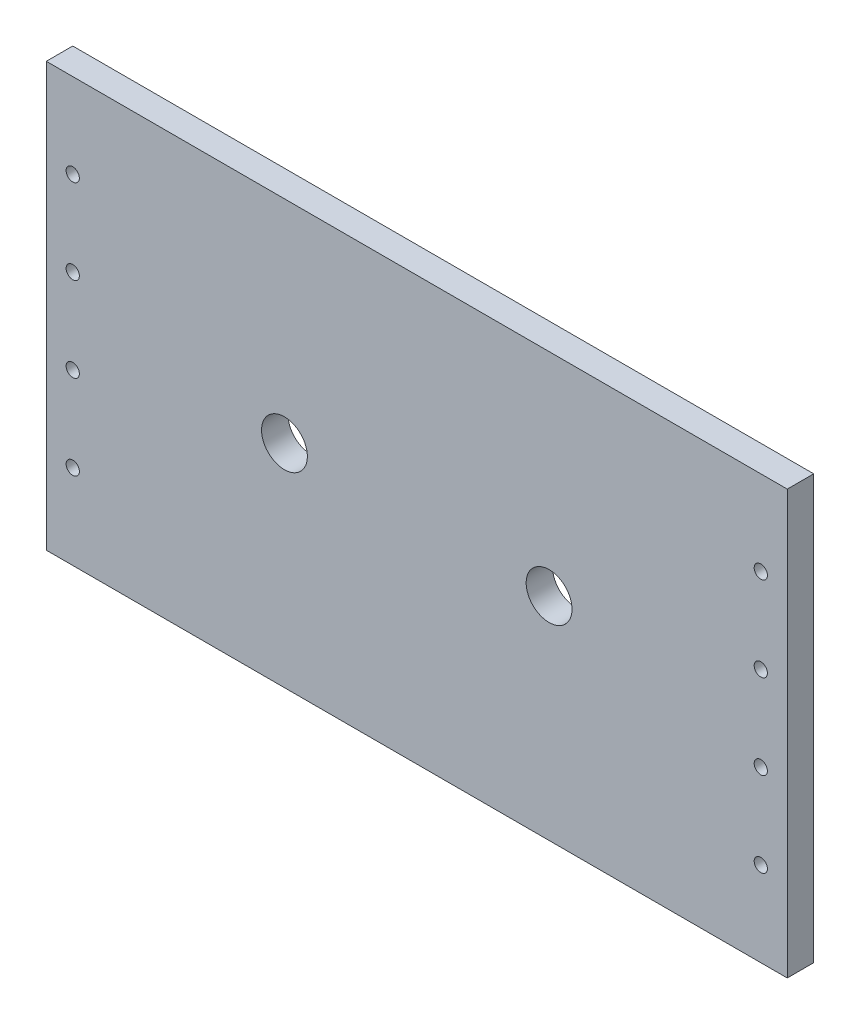
ISO-10303-21;
HEADER;
FILE_DESCRIPTION(('STEP AP214'),'2;1');
FILE_NAME('part.step','',(''),(''),'','','');
FILE_SCHEMA(('AUTOMOTIVE_DESIGN { 1 0 10303 214 1 1 1 1 }'));
ENDSEC;
DATA;
#1=APPLICATION_CONTEXT('core data for automotive mechanical design processes');
#2=APPLICATION_PROTOCOL_DEFINITION('international standard','automotive_design',2000,#1);
#3=PRODUCT_CONTEXT('',#1,'mechanical');
#4=PRODUCT('Part','Part','',(#3));
#5=PRODUCT_RELATED_PRODUCT_CATEGORY('part','',(#4));
#6=PRODUCT_DEFINITION_FORMATION('','',#4);
#7=PRODUCT_DEFINITION_CONTEXT('part definition',#1,'design');
#8=PRODUCT_DEFINITION('design','',#6,#7);
#9=PRODUCT_DEFINITION_SHAPE('','',#8);
#10=(LENGTH_UNIT() NAMED_UNIT(*) SI_UNIT(.MILLI.,.METRE.));
#11=(NAMED_UNIT(*) PLANE_ANGLE_UNIT() SI_UNIT($,.RADIAN.));
#12=(NAMED_UNIT(*) SI_UNIT($,.STERADIAN.) SOLID_ANGLE_UNIT());
#13=UNCERTAINTY_MEASURE_WITH_UNIT(LENGTH_MEASURE(1.E-05),#10,'distance_accuracy_value','');
#14=(GEOMETRIC_REPRESENTATION_CONTEXT(3) GLOBAL_UNCERTAINTY_ASSIGNED_CONTEXT((#13)) GLOBAL_UNIT_ASSIGNED_CONTEXT((#10,
#11,#12)) REPRESENTATION_CONTEXT('',''));
#15=CARTESIAN_POINT('',(0.,0.,0.));
#16=DIRECTION('',(0.,0.,1.));
#17=DIRECTION('',(1.,0.,0.));
#18=AXIS2_PLACEMENT_3D('',#15,#16,#17);
#19=CARTESIAN_POINT('',(0.,0.,6.35));
#20=DIRECTION('',(1.,0.,0.));
#21=DIRECTION('',(0.,0.,-1.));
#22=AXIS2_PLACEMENT_3D('',#19,#20,#21);
#23=PLANE('',#22);
#24=DIRECTION('',(0.,-1.,0.));
#25=VECTOR('',#24,1.);
#26=CARTESIAN_POINT('',(0.,0.,0.));
#27=LINE('',#26,#25);
#28=CARTESIAN_POINT('',(0.,101.6,0.));
#29=VERTEX_POINT('',#28);
#30=CARTESIAN_POINT('',(0.,0.,0.));
#31=VERTEX_POINT('',#30);
#32=EDGE_CURVE('E107',#29,#31,#27,.T.);
#33=ORIENTED_EDGE('',*,*,#32,.T.);
#34=DIRECTION('',(0.,0.,-1.));
#35=VECTOR('',#34,1.);
#36=CARTESIAN_POINT('',(0.,0.,6.35));
#37=LINE('',#36,#35);
#38=CARTESIAN_POINT('',(0.,0.,6.35));
#39=VERTEX_POINT('',#38);
#40=EDGE_CURVE('E11',#39,#31,#37,.T.);
#41=ORIENTED_EDGE('',*,*,#40,.F.);
#42=DIRECTION('',(0.,-1.,0.));
#43=VECTOR('',#42,1.);
#44=CARTESIAN_POINT('',(0.,0.,6.35));
#45=LINE('',#44,#43);
#46=CARTESIAN_POINT('',(0.,101.6,6.35));
#47=VERTEX_POINT('',#46);
#48=EDGE_CURVE('E91',#47,#39,#45,.T.);
#49=ORIENTED_EDGE('',*,*,#48,.F.);
#50=DIRECTION('',(0.,0.,-1.));
#51=VECTOR('',#50,1.);
#52=CARTESIAN_POINT('',(0.,101.6,6.35));
#53=LINE('',#52,#51);
#54=EDGE_CURVE('E103',#47,#29,#53,.T.);
#55=ORIENTED_EDGE('',*,*,#54,.T.);
#56=EDGE_LOOP('',(#33,#41,#49,#55));
#57=FACE_BOUND('',#56,.T.);
#58=ADVANCED_FACE('F39',(#57),#23,.F.);
#59=CARTESIAN_POINT('',(0.,0.,6.35));
#60=DIRECTION('',(0.,1.,0.));
#61=DIRECTION('',(0.,0.,1.));
#62=AXIS2_PLACEMENT_3D('',#59,#60,#61);
#63=PLANE('',#62);
#64=DIRECTION('',(1.,0.,0.));
#65=VECTOR('',#64,1.);
#66=CARTESIAN_POINT('',(0.,0.,0.));
#67=LINE('',#66,#65);
#68=CARTESIAN_POINT('',(177.8,0.,0.));
#69=VERTEX_POINT('',#68);
#70=EDGE_CURVE('E96',#31,#69,#67,.T.);
#71=ORIENTED_EDGE('',*,*,#70,.T.);
#72=DIRECTION('',(0.,0.,-1.));
#73=VECTOR('',#72,1.);
#74=CARTESIAN_POINT('',(177.8,0.,6.35));
#75=LINE('',#74,#73);
#76=CARTESIAN_POINT('',(177.8,0.,6.35));
#77=VERTEX_POINT('',#76);
#78=EDGE_CURVE('E48',#77,#69,#75,.T.);
#79=ORIENTED_EDGE('',*,*,#78,.F.);
#80=DIRECTION('',(1.,0.,0.));
#81=VECTOR('',#80,1.);
#82=CARTESIAN_POINT('',(0.,0.,6.35));
#83=LINE('',#82,#81);
#84=EDGE_CURVE('E86',#39,#77,#83,.T.);
#85=ORIENTED_EDGE('',*,*,#84,.F.);
#86=ORIENTED_EDGE('',*,*,#40,.T.);
#87=EDGE_LOOP('',(#71,#79,#85,#86));
#88=FACE_BOUND('',#87,.T.);
#89=ADVANCED_FACE('F95',(#88),#63,.F.);
#90=CARTESIAN_POINT('',(177.8,0.,6.35));
#91=DIRECTION('',(-1.,0.,0.));
#92=DIRECTION('',(0.,0.,1.));
#93=AXIS2_PLACEMENT_3D('',#90,#91,#92);
#94=PLANE('',#93);
#95=DIRECTION('',(0.,1.,0.));
#96=VECTOR('',#95,1.);
#97=CARTESIAN_POINT('',(177.8,0.,0.));
#98=LINE('',#97,#96);
#99=CARTESIAN_POINT('',(177.8,101.6,0.));
#100=VERTEX_POINT('',#99);
#101=EDGE_CURVE('E73',#69,#100,#98,.T.);
#102=ORIENTED_EDGE('',*,*,#101,.T.);
#103=DIRECTION('',(0.,0.,-1.));
#104=VECTOR('',#103,1.);
#105=CARTESIAN_POINT('',(177.8,101.6,6.35));
#106=LINE('',#105,#104);
#107=CARTESIAN_POINT('',(177.8,101.6,6.35));
#108=VERTEX_POINT('',#107);
#109=EDGE_CURVE('E98',#108,#100,#106,.T.);
#110=ORIENTED_EDGE('',*,*,#109,.F.);
#111=DIRECTION('',(0.,1.,0.));
#112=VECTOR('',#111,1.);
#113=CARTESIAN_POINT('',(177.8,0.,6.35));
#114=LINE('',#113,#112);
#115=EDGE_CURVE('E89',#77,#108,#114,.T.);
#116=ORIENTED_EDGE('',*,*,#115,.F.);
#117=ORIENTED_EDGE('',*,*,#78,.T.);
#118=EDGE_LOOP('',(#102,#110,#116,#117));
#119=FACE_BOUND('',#118,.T.);
#120=ADVANCED_FACE('F99',(#119),#94,.F.);
#121=CARTESIAN_POINT('',(0.,101.6,6.35));
#122=DIRECTION('',(0.,-1.,0.));
#123=DIRECTION('',(0.,0.,-1.));
#124=AXIS2_PLACEMENT_3D('',#121,#122,#123);
#125=PLANE('',#124);
#126=DIRECTION('',(-1.,0.,0.));
#127=VECTOR('',#126,1.);
#128=CARTESIAN_POINT('',(0.,101.6,0.));
#129=LINE('',#128,#127);
#130=EDGE_CURVE('E79',#100,#29,#129,.T.);
#131=ORIENTED_EDGE('',*,*,#130,.T.);
#132=ORIENTED_EDGE('',*,*,#54,.F.);
#133=DIRECTION('',(-1.,0.,0.));
#134=VECTOR('',#133,1.);
#135=CARTESIAN_POINT('',(0.,101.6,6.35));
#136=LINE('',#135,#134);
#137=EDGE_CURVE('E56',#108,#47,#136,.T.);
#138=ORIENTED_EDGE('',*,*,#137,.F.);
#139=ORIENTED_EDGE('',*,*,#109,.T.);
#140=EDGE_LOOP('',(#131,#132,#138,#139));
#141=FACE_BOUND('',#140,.T.);
#142=ADVANCED_FACE('F121',(#141),#125,.F.);
#143=CARTESIAN_POINT('',(0.,0.,6.35));
#144=DIRECTION('',(0.,0.,-1.));
#145=DIRECTION('',(-1.,0.,0.));
#146=AXIS2_PLACEMENT_3D('',#143,#144,#145);
#147=PLANE('',#146);
#148=CARTESIAN_POINT('',(120.65,50.8,6.35));
#149=DIRECTION('',(0.,0.,1.));
#150=DIRECTION('',(1.,0.,0.));
#151=AXIS2_PLACEMENT_3D('',#148,#149,#150);
#152=CIRCLE('',#151,5.49926131403117);
#153=CARTESIAN_POINT('',(126.149261314031,50.8,6.35));
#154=VERTEX_POINT('',#153);
#155=EDGE_CURVE('E200',#154,#154,#152,.T.);
#156=ORIENTED_EDGE('',*,*,#155,.F.);
#157=EDGE_LOOP('',(#156));
#158=FACE_BOUND('',#157,.T.);
#159=CARTESIAN_POINT('',(57.15,50.8,6.35));
#160=DIRECTION('',(0.,0.,1.));
#161=DIRECTION('',(1.,0.,0.));
#162=AXIS2_PLACEMENT_3D('',#159,#160,#161);
#163=CIRCLE('',#162,5.49926131403118);
#164=CARTESIAN_POINT('',(62.6492613140312,50.8,6.35));
#165=VERTEX_POINT('',#164);
#166=EDGE_CURVE('E192',#165,#165,#163,.T.);
#167=ORIENTED_EDGE('',*,*,#166,.F.);
#168=EDGE_LOOP('',(#167));
#169=FACE_BOUND('',#168,.T.);
#170=CARTESIAN_POINT('',(6.34999999999999,60.96,6.35));
#171=DIRECTION('',(0.,0.,1.));
#172=DIRECTION('',(1.,0.,0.));
#173=AXIS2_PLACEMENT_3D('',#170,#171,#172);
#174=CIRCLE('',#173,1.5875);
#175=CARTESIAN_POINT('',(7.9375,60.96,6.35));
#176=VERTEX_POINT('',#175);
#177=EDGE_CURVE('E161',#176,#176,#174,.T.);
#178=ORIENTED_EDGE('',*,*,#177,.F.);
#179=EDGE_LOOP('',(#178));
#180=FACE_BOUND('',#179,.T.);
#181=CARTESIAN_POINT('',(6.34999999999999,40.64,6.35));
#182=DIRECTION('',(0.,0.,1.));
#183=DIRECTION('',(1.,0.,0.));
#184=AXIS2_PLACEMENT_3D('',#181,#182,#183);
#185=CIRCLE('',#184,1.5875);
#186=CARTESIAN_POINT('',(7.93749999999999,40.64,6.35));
#187=VERTEX_POINT('',#186);
#188=EDGE_CURVE('E153',#187,#187,#185,.T.);
#189=ORIENTED_EDGE('',*,*,#188,.F.);
#190=EDGE_LOOP('',(#189));
#191=FACE_BOUND('',#190,.T.);
#192=CARTESIAN_POINT('',(6.34999999999999,20.32,6.35));
#193=DIRECTION('',(0.,0.,1.));
#194=DIRECTION('',(1.,0.,0.));
#195=AXIS2_PLACEMENT_3D('',#192,#193,#194);
#196=CIRCLE('',#195,1.5875);
#197=CARTESIAN_POINT('',(7.93749999999999,20.32,6.35));
#198=VERTEX_POINT('',#197);
#199=EDGE_CURVE('E145',#198,#198,#196,.T.);
#200=ORIENTED_EDGE('',*,*,#199,.F.);
#201=EDGE_LOOP('',(#200));
#202=FACE_BOUND('',#201,.T.);
#203=CARTESIAN_POINT('',(171.45,20.32,6.35));
#204=DIRECTION('',(0.,0.,1.));
#205=DIRECTION('',(1.,0.,0.));
#206=AXIS2_PLACEMENT_3D('',#203,#204,#205);
#207=CIRCLE('',#206,1.58749999999999);
#208=CARTESIAN_POINT('',(173.0375,20.32,6.35));
#209=VERTEX_POINT('',#208);
#210=EDGE_CURVE('E136',#209,#209,#207,.T.);
#211=ORIENTED_EDGE('',*,*,#210,.F.);
#212=EDGE_LOOP('',(#211));
#213=FACE_BOUND('',#212,.T.);
#214=CARTESIAN_POINT('',(171.45,40.64,6.35));
#215=DIRECTION('',(0.,0.,1.));
#216=DIRECTION('',(1.,0.,0.));
#217=AXIS2_PLACEMENT_3D('',#214,#215,#216);
#218=CIRCLE('',#217,1.58749999999999);
#219=CARTESIAN_POINT('',(173.0375,40.64,6.35));
#220=VERTEX_POINT('',#219);
#221=EDGE_CURVE('E185',#220,#220,#218,.T.);
#222=ORIENTED_EDGE('',*,*,#221,.F.);
#223=EDGE_LOOP('',(#222));
#224=FACE_BOUND('',#223,.T.);
#225=CARTESIAN_POINT('',(171.45,60.96,6.35));
#226=DIRECTION('',(0.,0.,1.));
#227=DIRECTION('',(1.,0.,0.));
#228=AXIS2_PLACEMENT_3D('',#225,#226,#227);
#229=CIRCLE('',#228,1.58749999999999);
#230=CARTESIAN_POINT('',(173.0375,60.96,6.35));
#231=VERTEX_POINT('',#230);
#232=EDGE_CURVE('E177',#231,#231,#229,.T.);
#233=ORIENTED_EDGE('',*,*,#232,.F.);
#234=EDGE_LOOP('',(#233));
#235=FACE_BOUND('',#234,.T.);
#236=CARTESIAN_POINT('',(171.45,81.28,6.35));
#237=DIRECTION('',(0.,0.,1.));
#238=DIRECTION('',(1.,0.,0.));
#239=AXIS2_PLACEMENT_3D('',#236,#237,#238);
#240=CIRCLE('',#239,1.58749999999999);
#241=CARTESIAN_POINT('',(173.0375,81.28,6.35));
#242=VERTEX_POINT('',#241);
#243=EDGE_CURVE('E168',#242,#242,#240,.T.);
#244=ORIENTED_EDGE('',*,*,#243,.F.);
#245=EDGE_LOOP('',(#244));
#246=FACE_BOUND('',#245,.T.);
#247=CARTESIAN_POINT('',(6.34999999999999,81.28,6.35));
#248=DIRECTION('',(0.,0.,1.));
#249=DIRECTION('',(1.,0.,0.));
#250=AXIS2_PLACEMENT_3D('',#247,#248,#249);
#251=CIRCLE('',#250,1.5875);
#252=CARTESIAN_POINT('',(7.93749999999999,81.28,6.35));
#253=VERTEX_POINT('',#252);
#254=EDGE_CURVE('E128',#253,#253,#251,.T.);
#255=ORIENTED_EDGE('',*,*,#254,.F.);
#256=EDGE_LOOP('',(#255));
#257=FACE_BOUND('',#256,.T.);
#258=ORIENTED_EDGE('',*,*,#48,.T.);
#259=ORIENTED_EDGE('',*,*,#84,.T.);
#260=ORIENTED_EDGE('',*,*,#115,.T.);
#261=ORIENTED_EDGE('',*,*,#137,.T.);
#262=EDGE_LOOP('',(#258,#259,#260,#261));
#263=FACE_BOUND('',#262,.T.);
#264=ADVANCED_FACE('F87',(#158,#169,#180,#191,#202,#213,#224,#235,#246,#257,#263),#147,.F.);
#265=CARTESIAN_POINT('',(0.,0.,0.));
#266=DIRECTION('',(0.,0.,-1.));
#267=DIRECTION('',(-1.,0.,0.));
#268=AXIS2_PLACEMENT_3D('',#265,#266,#267);
#269=PLANE('',#268);
#270=CARTESIAN_POINT('',(120.65,50.8,0.));
#271=DIRECTION('',(0.,0.,1.));
#272=DIRECTION('',(1.,0.,0.));
#273=AXIS2_PLACEMENT_3D('',#270,#271,#272);
#274=CIRCLE('',#273,5.49926131403117);
#275=CARTESIAN_POINT('',(126.149261314031,50.8,0.));
#276=VERTEX_POINT('',#275);
#277=EDGE_CURVE('E173',#276,#276,#274,.T.);
#278=ORIENTED_EDGE('',*,*,#277,.T.);
#279=EDGE_LOOP('',(#278));
#280=FACE_BOUND('',#279,.T.);
#281=CARTESIAN_POINT('',(57.15,50.8,0.));
#282=DIRECTION('',(0.,0.,1.));
#283=DIRECTION('',(1.,0.,0.));
#284=AXIS2_PLACEMENT_3D('',#281,#282,#283);
#285=CIRCLE('',#284,5.49926131403118);
#286=CARTESIAN_POINT('',(62.6492613140312,50.8,0.));
#287=VERTEX_POINT('',#286);
#288=EDGE_CURVE('E196',#287,#287,#285,.T.);
#289=ORIENTED_EDGE('',*,*,#288,.T.);
#290=EDGE_LOOP('',(#289));
#291=FACE_BOUND('',#290,.T.);
#292=CARTESIAN_POINT('',(6.34999999999999,60.96,0.));
#293=DIRECTION('',(0.,0.,1.));
#294=DIRECTION('',(1.,0.,0.));
#295=AXIS2_PLACEMENT_3D('',#292,#293,#294);
#296=CIRCLE('',#295,1.5875);
#297=CARTESIAN_POINT('',(7.9375,60.96,0.));
#298=VERTEX_POINT('',#297);
#299=EDGE_CURVE('E132',#298,#298,#296,.T.);
#300=ORIENTED_EDGE('',*,*,#299,.T.);
#301=EDGE_LOOP('',(#300));
#302=FACE_BOUND('',#301,.T.);
#303=CARTESIAN_POINT('',(6.34999999999999,40.64,0.));
#304=DIRECTION('',(0.,0.,1.));
#305=DIRECTION('',(1.,0.,0.));
#306=AXIS2_PLACEMENT_3D('',#303,#304,#305);
#307=CIRCLE('',#306,1.5875);
#308=CARTESIAN_POINT('',(7.93749999999999,40.64,0.));
#309=VERTEX_POINT('',#308);
#310=EDGE_CURVE('E157',#309,#309,#307,.T.);
#311=ORIENTED_EDGE('',*,*,#310,.T.);
#312=EDGE_LOOP('',(#311));
#313=FACE_BOUND('',#312,.T.);
#314=CARTESIAN_POINT('',(6.34999999999999,20.32,0.));
#315=DIRECTION('',(0.,0.,1.));
#316=DIRECTION('',(1.,0.,0.));
#317=AXIS2_PLACEMENT_3D('',#314,#315,#316);
#318=CIRCLE('',#317,1.5875);
#319=CARTESIAN_POINT('',(7.93749999999999,20.32,0.));
#320=VERTEX_POINT('',#319);
#321=EDGE_CURVE('E149',#320,#320,#318,.T.);
#322=ORIENTED_EDGE('',*,*,#321,.T.);
#323=EDGE_LOOP('',(#322));
#324=FACE_BOUND('',#323,.T.);
#325=CARTESIAN_POINT('',(171.45,20.32,0.));
#326=DIRECTION('',(0.,0.,1.));
#327=DIRECTION('',(1.,0.,0.));
#328=AXIS2_PLACEMENT_3D('',#325,#326,#327);
#329=CIRCLE('',#328,1.58749999999999);
#330=CARTESIAN_POINT('',(173.0375,20.32,0.));
#331=VERTEX_POINT('',#330);
#332=EDGE_CURVE('E140',#331,#331,#329,.T.);
#333=ORIENTED_EDGE('',*,*,#332,.T.);
#334=EDGE_LOOP('',(#333));
#335=FACE_BOUND('',#334,.T.);
#336=CARTESIAN_POINT('',(171.45,40.64,0.));
#337=DIRECTION('',(0.,0.,1.));
#338=DIRECTION('',(1.,0.,0.));
#339=AXIS2_PLACEMENT_3D('',#336,#337,#338);
#340=CIRCLE('',#339,1.58749999999999);
#341=CARTESIAN_POINT('',(173.0375,40.64,0.));
#342=VERTEX_POINT('',#341);
#343=EDGE_CURVE('E141',#342,#342,#340,.T.);
#344=ORIENTED_EDGE('',*,*,#343,.T.);
#345=EDGE_LOOP('',(#344));
#346=FACE_BOUND('',#345,.T.);
#347=CARTESIAN_POINT('',(171.45,60.96,0.));
#348=DIRECTION('',(0.,0.,1.));
#349=DIRECTION('',(1.,0.,0.));
#350=AXIS2_PLACEMENT_3D('',#347,#348,#349);
#351=CIRCLE('',#350,1.58749999999999);
#352=CARTESIAN_POINT('',(173.0375,60.96,0.));
#353=VERTEX_POINT('',#352);
#354=EDGE_CURVE('E181',#353,#353,#351,.T.);
#355=ORIENTED_EDGE('',*,*,#354,.T.);
#356=EDGE_LOOP('',(#355));
#357=FACE_BOUND('',#356,.T.);
#358=CARTESIAN_POINT('',(171.45,81.28,0.));
#359=DIRECTION('',(0.,0.,1.));
#360=DIRECTION('',(1.,0.,0.));
#361=AXIS2_PLACEMENT_3D('',#358,#359,#360);
#362=CIRCLE('',#361,1.58749999999999);
#363=CARTESIAN_POINT('',(173.0375,81.28,0.));
#364=VERTEX_POINT('',#363);
#365=EDGE_CURVE('E172',#364,#364,#362,.T.);
#366=ORIENTED_EDGE('',*,*,#365,.T.);
#367=EDGE_LOOP('',(#366));
#368=FACE_BOUND('',#367,.T.);
#369=CARTESIAN_POINT('',(6.34999999999999,81.28,0.));
#370=DIRECTION('',(0.,0.,1.));
#371=DIRECTION('',(1.,0.,0.));
#372=AXIS2_PLACEMENT_3D('',#369,#370,#371);
#373=CIRCLE('',#372,1.5875);
#374=CARTESIAN_POINT('',(7.93749999999999,81.28,0.));
#375=VERTEX_POINT('',#374);
#376=EDGE_CURVE('E111',#375,#375,#373,.T.);
#377=ORIENTED_EDGE('',*,*,#376,.T.);
#378=EDGE_LOOP('',(#377));
#379=FACE_BOUND('',#378,.T.);
#380=ORIENTED_EDGE('',*,*,#32,.F.);
#381=ORIENTED_EDGE('',*,*,#130,.F.);
#382=ORIENTED_EDGE('',*,*,#101,.F.);
#383=ORIENTED_EDGE('',*,*,#70,.F.);
#384=EDGE_LOOP('',(#380,#381,#382,#383));
#385=FACE_BOUND('',#384,.T.);
#386=ADVANCED_FACE('F124',(#280,#291,#302,#313,#324,#335,#346,#357,#368,#379,#385),#269,.T.);
#387=CARTESIAN_POINT('',(6.34999999999999,81.28,0.));
#388=DIRECTION('',(0.,0.,1.));
#389=DIRECTION('',(1.,0.,0.));
#390=AXIS2_PLACEMENT_3D('',#387,#388,#389);
#391=CYLINDRICAL_SURFACE('',#390,1.5875);
#392=ORIENTED_EDGE('',*,*,#376,.F.);
#393=EDGE_LOOP('',(#392));
#394=FACE_BOUND('',#393,.T.);
#395=ORIENTED_EDGE('',*,*,#254,.T.);
#396=EDGE_LOOP('',(#395));
#397=FACE_BOUND('',#396,.T.);
#398=ADVANCED_FACE('F238',(#394,#397),#391,.F.);
#399=CARTESIAN_POINT('',(171.45,81.28,0.));
#400=DIRECTION('',(0.,0.,1.));
#401=DIRECTION('',(1.,0.,0.));
#402=AXIS2_PLACEMENT_3D('',#399,#400,#401);
#403=CYLINDRICAL_SURFACE('',#402,1.58749999999999);
#404=ORIENTED_EDGE('',*,*,#365,.F.);
#405=EDGE_LOOP('',(#404));
#406=FACE_BOUND('',#405,.T.);
#407=ORIENTED_EDGE('',*,*,#243,.T.);
#408=EDGE_LOOP('',(#407));
#409=FACE_BOUND('',#408,.T.);
#410=ADVANCED_FACE('F240',(#406,#409),#403,.F.);
#411=CARTESIAN_POINT('',(171.45,60.96,0.));
#412=DIRECTION('',(0.,0.,1.));
#413=DIRECTION('',(1.,0.,0.));
#414=AXIS2_PLACEMENT_3D('',#411,#412,#413);
#415=CYLINDRICAL_SURFACE('',#414,1.58749999999999);
#416=ORIENTED_EDGE('',*,*,#354,.F.);
#417=EDGE_LOOP('',(#416));
#418=FACE_BOUND('',#417,.T.);
#419=ORIENTED_EDGE('',*,*,#232,.T.);
#420=EDGE_LOOP('',(#419));
#421=FACE_BOUND('',#420,.T.);
#422=ADVANCED_FACE('F247',(#418,#421),#415,.F.);
#423=CARTESIAN_POINT('',(171.45,40.64,0.));
#424=DIRECTION('',(0.,0.,1.));
#425=DIRECTION('',(1.,0.,0.));
#426=AXIS2_PLACEMENT_3D('',#423,#424,#425);
#427=CYLINDRICAL_SURFACE('',#426,1.58749999999999);
#428=ORIENTED_EDGE('',*,*,#343,.F.);
#429=EDGE_LOOP('',(#428));
#430=FACE_BOUND('',#429,.T.);
#431=ORIENTED_EDGE('',*,*,#221,.T.);
#432=EDGE_LOOP('',(#431));
#433=FACE_BOUND('',#432,.T.);
#434=ADVANCED_FACE('F324',(#430,#433),#427,.F.);
#435=CARTESIAN_POINT('',(171.45,20.32,0.));
#436=DIRECTION('',(0.,0.,1.));
#437=DIRECTION('',(1.,0.,0.));
#438=AXIS2_PLACEMENT_3D('',#435,#436,#437);
#439=CYLINDRICAL_SURFACE('',#438,1.58749999999999);
#440=ORIENTED_EDGE('',*,*,#332,.F.);
#441=EDGE_LOOP('',(#440));
#442=FACE_BOUND('',#441,.T.);
#443=ORIENTED_EDGE('',*,*,#210,.T.);
#444=EDGE_LOOP('',(#443));
#445=FACE_BOUND('',#444,.T.);
#446=ADVANCED_FACE('F316',(#442,#445),#439,.F.);
#447=CARTESIAN_POINT('',(6.34999999999999,20.32,0.));
#448=DIRECTION('',(0.,0.,1.));
#449=DIRECTION('',(1.,0.,0.));
#450=AXIS2_PLACEMENT_3D('',#447,#448,#449);
#451=CYLINDRICAL_SURFACE('',#450,1.5875);
#452=ORIENTED_EDGE('',*,*,#321,.F.);
#453=EDGE_LOOP('',(#452));
#454=FACE_BOUND('',#453,.T.);
#455=ORIENTED_EDGE('',*,*,#199,.T.);
#456=EDGE_LOOP('',(#455));
#457=FACE_BOUND('',#456,.T.);
#458=ADVANCED_FACE('F308',(#454,#457),#451,.F.);
#459=CARTESIAN_POINT('',(6.34999999999999,40.64,0.));
#460=DIRECTION('',(0.,0.,1.));
#461=DIRECTION('',(1.,0.,0.));
#462=AXIS2_PLACEMENT_3D('',#459,#460,#461);
#463=CYLINDRICAL_SURFACE('',#462,1.5875);
#464=ORIENTED_EDGE('',*,*,#310,.F.);
#465=EDGE_LOOP('',(#464));
#466=FACE_BOUND('',#465,.T.);
#467=ORIENTED_EDGE('',*,*,#188,.T.);
#468=EDGE_LOOP('',(#467));
#469=FACE_BOUND('',#468,.T.);
#470=ADVANCED_FACE('F301',(#466,#469),#463,.F.);
#471=CARTESIAN_POINT('',(6.34999999999999,60.96,0.));
#472=DIRECTION('',(0.,0.,1.));
#473=DIRECTION('',(1.,0.,0.));
#474=AXIS2_PLACEMENT_3D('',#471,#472,#473);
#475=CYLINDRICAL_SURFACE('',#474,1.5875);
#476=ORIENTED_EDGE('',*,*,#299,.F.);
#477=EDGE_LOOP('',(#476));
#478=FACE_BOUND('',#477,.T.);
#479=ORIENTED_EDGE('',*,*,#177,.T.);
#480=EDGE_LOOP('',(#479));
#481=FACE_BOUND('',#480,.T.);
#482=ADVANCED_FACE('F286',(#478,#481),#475,.F.);
#483=CARTESIAN_POINT('',(57.15,50.8,0.));
#484=DIRECTION('',(0.,0.,1.));
#485=DIRECTION('',(1.,0.,0.));
#486=AXIS2_PLACEMENT_3D('',#483,#484,#485);
#487=CYLINDRICAL_SURFACE('',#486,5.49926131403118);
#488=ORIENTED_EDGE('',*,*,#288,.F.);
#489=EDGE_LOOP('',(#488));
#490=FACE_BOUND('',#489,.T.);
#491=ORIENTED_EDGE('',*,*,#166,.T.);
#492=EDGE_LOOP('',(#491));
#493=FACE_BOUND('',#492,.T.);
#494=ADVANCED_FACE('F213',(#490,#493),#487,.F.);
#495=CARTESIAN_POINT('',(120.65,50.8,0.));
#496=DIRECTION('',(0.,0.,1.));
#497=DIRECTION('',(1.,0.,0.));
#498=AXIS2_PLACEMENT_3D('',#495,#496,#497);
#499=CYLINDRICAL_SURFACE('',#498,5.49926131403117);
#500=ORIENTED_EDGE('',*,*,#277,.F.);
#501=EDGE_LOOP('',(#500));
#502=FACE_BOUND('',#501,.T.);
#503=ORIENTED_EDGE('',*,*,#155,.T.);
#504=EDGE_LOOP('',(#503));
#505=FACE_BOUND('',#504,.T.);
#506=ADVANCED_FACE('F210',(#502,#505),#499,.F.);
#507=CLOSED_SHELL('',(#58,#89,#120,#142,#264,#386,#398,#410,#422,#434,#446,#458,#470,#482,#494,#506));
#508=MANIFOLD_SOLID_BREP('B2',#507);
#509=ADVANCED_BREP_SHAPE_REPRESENTATION('',(#18,#508),#14);
#510=SHAPE_DEFINITION_REPRESENTATION(#9,#509);
ENDSEC;
END-ISO-10303-21;
